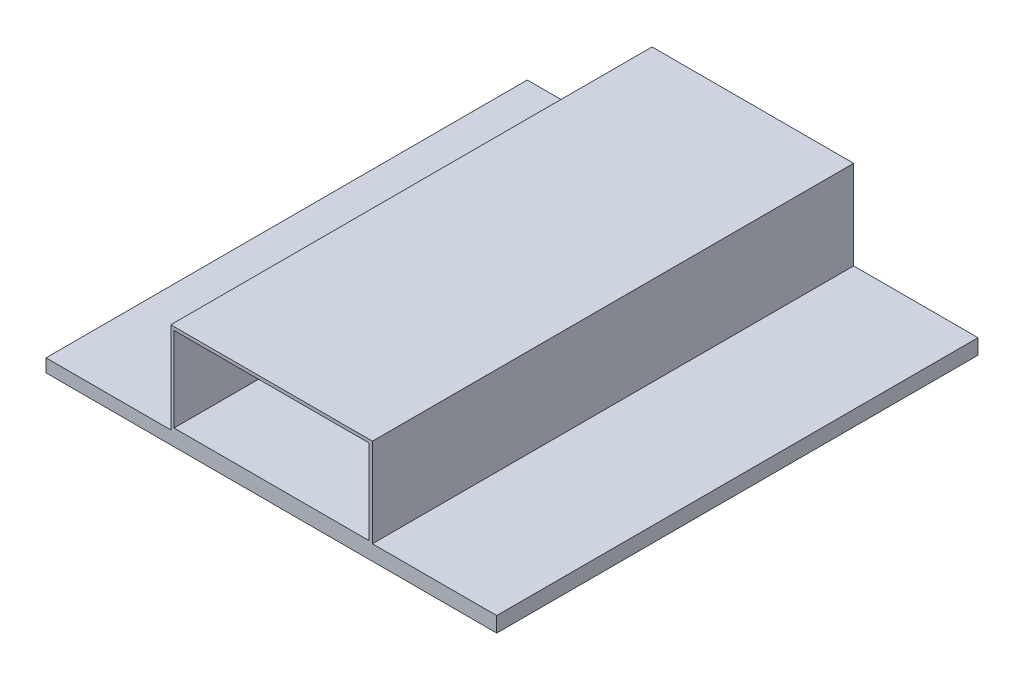
ISO-10303-21;
HEADER;
FILE_DESCRIPTION(('STEP AP214'),'2;1');
FILE_NAME('part.step','',(''),(''),'','','');
FILE_SCHEMA(('AUTOMOTIVE_DESIGN { 1 0 10303 214 1 1 1 1 }'));
ENDSEC;
DATA;
#1=APPLICATION_CONTEXT('core data for automotive mechanical design processes');
#2=APPLICATION_PROTOCOL_DEFINITION('international standard','automotive_design',2000,#1);
#3=PRODUCT_CONTEXT('',#1,'mechanical');
#4=PRODUCT('Part','Part','',(#3));
#5=PRODUCT_RELATED_PRODUCT_CATEGORY('part','',(#4));
#6=PRODUCT_DEFINITION_FORMATION('','',#4);
#7=PRODUCT_DEFINITION_CONTEXT('part definition',#1,'design');
#8=PRODUCT_DEFINITION('design','',#6,#7);
#9=PRODUCT_DEFINITION_SHAPE('','',#8);
#10=(LENGTH_UNIT() NAMED_UNIT(*) SI_UNIT(.MILLI.,.METRE.));
#11=(NAMED_UNIT(*) PLANE_ANGLE_UNIT() SI_UNIT($,.RADIAN.));
#12=(NAMED_UNIT(*) SI_UNIT($,.STERADIAN.) SOLID_ANGLE_UNIT());
#13=UNCERTAINTY_MEASURE_WITH_UNIT(LENGTH_MEASURE(1.E-05),#10,'distance_accuracy_value','');
#14=(GEOMETRIC_REPRESENTATION_CONTEXT(3) GLOBAL_UNCERTAINTY_ASSIGNED_CONTEXT((#13)) GLOBAL_UNIT_ASSIGNED_CONTEXT((#10,
#11,#12)) REPRESENTATION_CONTEXT('',''));
#15=CARTESIAN_POINT('',(0.,0.,0.));
#16=DIRECTION('',(0.,0.,1.));
#17=DIRECTION('',(1.,0.,0.));
#18=AXIS2_PLACEMENT_3D('',#15,#16,#17);
#19=CARTESIAN_POINT('',(-35.,-6.5,74.));
#20=DIRECTION('',(0.,-1.,0.));
#21=DIRECTION('',(1.,0.,0.));
#22=AXIS2_PLACEMENT_3D('',#19,#20,#21);
#23=PLANE('',#22);
#24=DIRECTION('',(-1.,0.,0.));
#25=VECTOR('',#24,1.);
#26=CARTESIAN_POINT('',(-35.,-6.5,0.));
#27=LINE('',#26,#25);
#28=CARTESIAN_POINT('',(-15.8118848487096,-6.5,0.));
#29=VERTEX_POINT('',#28);
#30=CARTESIAN_POINT('',(-35.,-6.5,0.));
#31=VERTEX_POINT('',#30);
#32=EDGE_CURVE('E150',#29,#31,#27,.T.);
#33=ORIENTED_EDGE('',*,*,#32,.T.);
#34=DIRECTION('',(0.,0.,-1.));
#35=VECTOR('',#34,1.);
#36=CARTESIAN_POINT('',(-35.,-6.5,74.));
#37=LINE('',#36,#35);
#38=CARTESIAN_POINT('',(-35.,-6.5,74.));
#39=VERTEX_POINT('',#38);
#40=EDGE_CURVE('E11',#39,#31,#37,.T.);
#41=ORIENTED_EDGE('',*,*,#40,.F.);
#42=DIRECTION('',(-1.,0.,0.));
#43=VECTOR('',#42,1.);
#44=CARTESIAN_POINT('',(-35.,-6.5,74.));
#45=LINE('',#44,#43);
#46=CARTESIAN_POINT('',(-15.8118848487096,-6.5,74.));
#47=VERTEX_POINT('',#46);
#48=EDGE_CURVE('E161',#47,#39,#45,.T.);
#49=ORIENTED_EDGE('',*,*,#48,.F.);
#50=DIRECTION('',(0.,0.,-1.));
#51=VECTOR('',#50,1.);
#52=CARTESIAN_POINT('',(-15.8118848487096,-6.5,74.));
#53=LINE('',#52,#51);
#54=EDGE_CURVE('E142',#47,#29,#53,.T.);
#55=ORIENTED_EDGE('',*,*,#54,.T.);
#56=EDGE_LOOP('',(#33,#41,#49,#55));
#57=FACE_BOUND('',#56,.T.);
#58=ADVANCED_FACE('F39',(#57),#23,.F.);
#59=CARTESIAN_POINT('',(-35.,-6.5,74.));
#60=DIRECTION('',(1.,0.,0.));
#61=DIRECTION('',(0.,1.,0.));
#62=AXIS2_PLACEMENT_3D('',#59,#60,#61);
#63=PLANE('',#62);
#64=DIRECTION('',(0.,-1.,0.));
#65=VECTOR('',#64,1.);
#66=CARTESIAN_POINT('',(-35.,-6.5,0.));
#67=LINE('',#66,#65);
#68=CARTESIAN_POINT('',(-35.,-8.5,0.));
#69=VERTEX_POINT('',#68);
#70=EDGE_CURVE('E148',#31,#69,#67,.T.);
#71=ORIENTED_EDGE('',*,*,#70,.T.);
#72=DIRECTION('',(0.,0.,-1.));
#73=VECTOR('',#72,1.);
#74=CARTESIAN_POINT('',(-35.,-8.5,74.));
#75=LINE('',#74,#73);
#76=CARTESIAN_POINT('',(-35.,-8.5,74.));
#77=VERTEX_POINT('',#76);
#78=EDGE_CURVE('E46',#77,#69,#75,.T.);
#79=ORIENTED_EDGE('',*,*,#78,.F.);
#80=DIRECTION('',(0.,-1.,0.));
#81=VECTOR('',#80,1.);
#82=CARTESIAN_POINT('',(-35.,-6.5,74.));
#83=LINE('',#82,#81);
#84=EDGE_CURVE('E104',#39,#77,#83,.T.);
#85=ORIENTED_EDGE('',*,*,#84,.F.);
#86=ORIENTED_EDGE('',*,*,#40,.T.);
#87=EDGE_LOOP('',(#71,#79,#85,#86));
#88=FACE_BOUND('',#87,.T.);
#89=ADVANCED_FACE('F266',(#88),#63,.F.);
#90=CARTESIAN_POINT('',(-35.,-8.5,74.));
#91=DIRECTION('',(0.,1.,0.));
#92=DIRECTION('',(0.,0.,1.));
#93=AXIS2_PLACEMENT_3D('',#90,#91,#92);
#94=PLANE('',#93);
#95=DIRECTION('',(1.,0.,0.));
#96=VECTOR('',#95,1.);
#97=CARTESIAN_POINT('',(-35.,-8.5,0.));
#98=LINE('',#97,#96);
#99=CARTESIAN_POINT('',(34.3038478878868,-8.5,0.));
#100=VERTEX_POINT('',#99);
#101=EDGE_CURVE('E151',#69,#100,#98,.T.);
#102=ORIENTED_EDGE('',*,*,#101,.T.);
#103=DIRECTION('',(0.,0.,-1.));
#104=VECTOR('',#103,1.);
#105=CARTESIAN_POINT('',(34.3038478878868,-8.5,74.));
#106=LINE('',#105,#104);
#107=CARTESIAN_POINT('',(34.3038478878868,-8.5,74.));
#108=VERTEX_POINT('',#107);
#109=EDGE_CURVE('E169',#108,#100,#106,.T.);
#110=ORIENTED_EDGE('',*,*,#109,.F.);
#111=DIRECTION('',(1.,0.,0.));
#112=VECTOR('',#111,1.);
#113=CARTESIAN_POINT('',(-35.,-8.5,74.));
#114=LINE('',#113,#112);
#115=EDGE_CURVE('E178',#77,#108,#114,.T.);
#116=ORIENTED_EDGE('',*,*,#115,.F.);
#117=ORIENTED_EDGE('',*,*,#78,.T.);
#118=EDGE_LOOP('',(#102,#110,#116,#117));
#119=FACE_BOUND('',#118,.T.);
#120=ADVANCED_FACE('F176',(#119),#94,.F.);
#121=CARTESIAN_POINT('',(34.3038478878868,-8.5,74.));
#122=DIRECTION('',(-1.,0.,0.));
#123=DIRECTION('',(0.,0.,1.));
#124=AXIS2_PLACEMENT_3D('',#121,#122,#123);
#125=PLANE('',#124);
#126=DIRECTION('',(0.,1.,0.));
#127=VECTOR('',#126,1.);
#128=CARTESIAN_POINT('',(34.3038478878868,-8.5,0.));
#129=LINE('',#128,#127);
#130=CARTESIAN_POINT('',(34.3038478878868,-6.16277903220504,0.));
#131=VERTEX_POINT('',#130);
#132=EDGE_CURVE('E154',#100,#131,#129,.T.);
#133=ORIENTED_EDGE('',*,*,#132,.T.);
#134=DIRECTION('',(0.,0.,-1.));
#135=VECTOR('',#134,1.);
#136=CARTESIAN_POINT('',(34.3038478878868,-6.16277903220504,74.));
#137=LINE('',#136,#135);
#138=CARTESIAN_POINT('',(34.3038478878868,-6.16277903220504,74.));
#139=VERTEX_POINT('',#138);
#140=EDGE_CURVE('E167',#139,#131,#137,.T.);
#141=ORIENTED_EDGE('',*,*,#140,.F.);
#142=DIRECTION('',(0.,1.,0.));
#143=VECTOR('',#142,1.);
#144=CARTESIAN_POINT('',(34.3038478878868,-8.5,74.));
#145=LINE('',#144,#143);
#146=EDGE_CURVE('E189',#108,#139,#145,.T.);
#147=ORIENTED_EDGE('',*,*,#146,.F.);
#148=ORIENTED_EDGE('',*,*,#109,.T.);
#149=EDGE_LOOP('',(#133,#141,#147,#148));
#150=FACE_BOUND('',#149,.T.);
#151=ADVANCED_FACE('F186',(#150),#125,.F.);
#152=CARTESIAN_POINT('',(15.1881151512904,-6.16277903220504,74.));
#153=DIRECTION('',(0.,-1.,0.));
#154=DIRECTION('',(1.,0.,0.));
#155=AXIS2_PLACEMENT_3D('',#152,#153,#154);
#156=PLANE('',#155);
#157=DIRECTION('',(-1.,0.,0.));
#158=VECTOR('',#157,1.);
#159=CARTESIAN_POINT('',(15.1881151512904,-6.16277903220504,0.));
#160=LINE('',#159,#158);
#161=CARTESIAN_POINT('',(15.1881151512904,-6.16277903220504,0.));
#162=VERTEX_POINT('',#161);
#163=EDGE_CURVE('E160',#131,#162,#160,.T.);
#164=ORIENTED_EDGE('',*,*,#163,.T.);
#165=DIRECTION('',(0.,0.,-1.));
#166=VECTOR('',#165,1.);
#167=CARTESIAN_POINT('',(15.1881151512904,-6.16277903220504,74.));
#168=LINE('',#167,#166);
#169=CARTESIAN_POINT('',(15.1881151512904,-6.16277903220504,74.));
#170=VERTEX_POINT('',#169);
#171=EDGE_CURVE('E138',#170,#162,#168,.T.);
#172=ORIENTED_EDGE('',*,*,#171,.F.);
#173=DIRECTION('',(-1.,0.,0.));
#174=VECTOR('',#173,1.);
#175=CARTESIAN_POINT('',(15.1881151512904,-6.16277903220504,74.));
#176=LINE('',#175,#174);
#177=EDGE_CURVE('E128',#139,#170,#176,.T.);
#178=ORIENTED_EDGE('',*,*,#177,.F.);
#179=ORIENTED_EDGE('',*,*,#140,.T.);
#180=EDGE_LOOP('',(#164,#172,#178,#179));
#181=FACE_BOUND('',#180,.T.);
#182=ADVANCED_FACE('F188',(#181),#156,.F.);
#183=CARTESIAN_POINT('',(15.1881151512904,7.5,74.));
#184=DIRECTION('',(-1.,0.,0.));
#185=DIRECTION('',(0.,-1.,0.));
#186=AXIS2_PLACEMENT_3D('',#183,#184,#185);
#187=PLANE('',#186);
#188=DIRECTION('',(0.,1.,0.));
#189=VECTOR('',#188,1.);
#190=CARTESIAN_POINT('',(15.1881151512904,7.5,0.));
#191=LINE('',#190,#189);
#192=CARTESIAN_POINT('',(15.1881151512904,7.5,0.));
#193=VERTEX_POINT('',#192);
#194=EDGE_CURVE('E134',#162,#193,#191,.T.);
#195=ORIENTED_EDGE('',*,*,#194,.T.);
#196=DIRECTION('',(0.,0.,-1.));
#197=VECTOR('',#196,1.);
#198=CARTESIAN_POINT('',(15.1881151512904,7.5,74.));
#199=LINE('',#198,#197);
#200=CARTESIAN_POINT('',(15.1881151512904,7.5,74.));
#201=VERTEX_POINT('',#200);
#202=EDGE_CURVE('E135',#201,#193,#199,.T.);
#203=ORIENTED_EDGE('',*,*,#202,.F.);
#204=DIRECTION('',(0.,1.,0.));
#205=VECTOR('',#204,1.);
#206=CARTESIAN_POINT('',(15.1881151512904,7.5,74.));
#207=LINE('',#206,#205);
#208=EDGE_CURVE('E117',#170,#201,#207,.T.);
#209=ORIENTED_EDGE('',*,*,#208,.F.);
#210=ORIENTED_EDGE('',*,*,#171,.T.);
#211=EDGE_LOOP('',(#195,#203,#209,#210));
#212=FACE_BOUND('',#211,.T.);
#213=ADVANCED_FACE('F133',(#212),#187,.F.);
#214=CARTESIAN_POINT('',(-15.8118848487096,7.5,74.));
#215=DIRECTION('',(0.,-1.,0.));
#216=DIRECTION('',(0.,0.,-1.));
#217=AXIS2_PLACEMENT_3D('',#214,#215,#216);
#218=PLANE('',#217);
#219=DIRECTION('',(-1.,0.,0.));
#220=VECTOR('',#219,1.);
#221=CARTESIAN_POINT('',(-15.8118848487096,7.5,0.));
#222=LINE('',#221,#220);
#223=CARTESIAN_POINT('',(-15.8118848487096,7.5,0.));
#224=VERTEX_POINT('',#223);
#225=EDGE_CURVE('E158',#193,#224,#222,.T.);
#226=ORIENTED_EDGE('',*,*,#225,.T.);
#227=DIRECTION('',(0.,0.,-1.));
#228=VECTOR('',#227,1.);
#229=CARTESIAN_POINT('',(-15.8118848487096,7.5,74.));
#230=LINE('',#229,#228);
#231=CARTESIAN_POINT('',(-15.8118848487096,7.5,74.));
#232=VERTEX_POINT('',#231);
#233=EDGE_CURVE('E137',#232,#224,#230,.T.);
#234=ORIENTED_EDGE('',*,*,#233,.F.);
#235=DIRECTION('',(-1.,0.,0.));
#236=VECTOR('',#235,1.);
#237=CARTESIAN_POINT('',(-15.8118848487096,7.5,74.));
#238=LINE('',#237,#236);
#239=EDGE_CURVE('E121',#201,#232,#238,.T.);
#240=ORIENTED_EDGE('',*,*,#239,.F.);
#241=ORIENTED_EDGE('',*,*,#202,.T.);
#242=EDGE_LOOP('',(#226,#234,#240,#241));
#243=FACE_BOUND('',#242,.T.);
#244=ADVANCED_FACE('F141',(#243),#218,.F.);
#245=CARTESIAN_POINT('',(-15.8118848487096,-6.5,74.));
#246=DIRECTION('',(1.,0.,0.));
#247=DIRECTION('',(0.,0.,-1.));
#248=AXIS2_PLACEMENT_3D('',#245,#246,#247);
#249=PLANE('',#248);
#250=DIRECTION('',(0.,-1.,0.));
#251=VECTOR('',#250,1.);
#252=CARTESIAN_POINT('',(-15.8118848487096,-6.5,0.));
#253=LINE('',#252,#251);
#254=EDGE_CURVE('E94',#224,#29,#253,.T.);
#255=ORIENTED_EDGE('',*,*,#254,.T.);
#256=ORIENTED_EDGE('',*,*,#54,.F.);
#257=DIRECTION('',(0.,-1.,0.));
#258=VECTOR('',#257,1.);
#259=CARTESIAN_POINT('',(-15.8118848487096,-6.5,74.));
#260=LINE('',#259,#258);
#261=EDGE_CURVE('E65',#232,#47,#260,.T.);
#262=ORIENTED_EDGE('',*,*,#261,.F.);
#263=ORIENTED_EDGE('',*,*,#233,.T.);
#264=EDGE_LOOP('',(#255,#256,#262,#263));
#265=FACE_BOUND('',#264,.T.);
#266=ADVANCED_FACE('F273',(#265),#249,.F.);
#267=CARTESIAN_POINT('',(0.,0.,74.));
#268=DIRECTION('',(0.,0.,1.));
#269=DIRECTION('',(1.,0.,0.));
#270=AXIS2_PLACEMENT_3D('',#267,#268,#269);
#271=PLANE('',#270);
#272=DIRECTION('',(0.,1.,0.));
#273=VECTOR('',#272,1.);
#274=CARTESIAN_POINT('',(14.6881151512904,-6.00000000000001,74.));
#275=LINE('',#274,#273);
#276=CARTESIAN_POINT('',(14.6881151512904,-6.00000000000001,74.));
#277=VERTEX_POINT('',#276);
#278=CARTESIAN_POINT('',(14.6881151512904,6.99999999999999,74.));
#279=VERTEX_POINT('',#278);
#280=EDGE_CURVE('E52',#277,#279,#275,.T.);
#281=ORIENTED_EDGE('',*,*,#280,.F.);
#282=DIRECTION('',(1.,0.,0.));
#283=VECTOR('',#282,1.);
#284=CARTESIAN_POINT('',(-15.3118848487096,-6.00000000000001,74.));
#285=LINE('',#284,#283);
#286=CARTESIAN_POINT('',(-15.3118848487096,-6.00000000000001,74.));
#287=VERTEX_POINT('',#286);
#288=EDGE_CURVE('E208',#287,#277,#285,.T.);
#289=ORIENTED_EDGE('',*,*,#288,.F.);
#290=DIRECTION('',(0.,-1.,0.));
#291=VECTOR('',#290,1.);
#292=CARTESIAN_POINT('',(-15.3118848487096,-6.00000000000001,74.));
#293=LINE('',#292,#291);
#294=CARTESIAN_POINT('',(-15.3118848487096,6.99999999999999,74.));
#295=VERTEX_POINT('',#294);
#296=EDGE_CURVE('E209',#295,#287,#293,.T.);
#297=ORIENTED_EDGE('',*,*,#296,.F.);
#298=DIRECTION('',(-1.,0.,0.));
#299=VECTOR('',#298,1.);
#300=CARTESIAN_POINT('',(-15.3118848487096,6.99999999999999,74.));
#301=LINE('',#300,#299);
#302=EDGE_CURVE('E211',#279,#295,#301,.T.);
#303=ORIENTED_EDGE('',*,*,#302,.F.);
#304=EDGE_LOOP('',(#281,#289,#297,#303));
#305=FACE_BOUND('',#304,.T.);
#306=ORIENTED_EDGE('',*,*,#48,.T.);
#307=ORIENTED_EDGE('',*,*,#84,.T.);
#308=ORIENTED_EDGE('',*,*,#115,.T.);
#309=ORIENTED_EDGE('',*,*,#146,.T.);
#310=ORIENTED_EDGE('',*,*,#177,.T.);
#311=ORIENTED_EDGE('',*,*,#208,.T.);
#312=ORIENTED_EDGE('',*,*,#239,.T.);
#313=ORIENTED_EDGE('',*,*,#261,.T.);
#314=EDGE_LOOP('',(#306,#307,#308,#309,#310,#311,#312,#313));
#315=FACE_BOUND('',#314,.T.);
#316=ADVANCED_FACE('F123',(#305,#315),#271,.T.);
#317=CARTESIAN_POINT('',(0.,0.,0.));
#318=DIRECTION('',(0.,0.,1.));
#319=DIRECTION('',(1.,0.,0.));
#320=AXIS2_PLACEMENT_3D('',#317,#318,#319);
#321=PLANE('',#320);
#322=ORIENTED_EDGE('',*,*,#32,.F.);
#323=ORIENTED_EDGE('',*,*,#254,.F.);
#324=ORIENTED_EDGE('',*,*,#225,.F.);
#325=ORIENTED_EDGE('',*,*,#194,.F.);
#326=ORIENTED_EDGE('',*,*,#163,.F.);
#327=ORIENTED_EDGE('',*,*,#132,.F.);
#328=ORIENTED_EDGE('',*,*,#101,.F.);
#329=ORIENTED_EDGE('',*,*,#70,.F.);
#330=EDGE_LOOP('',(#322,#323,#324,#325,#326,#327,#328,#329));
#331=FACE_BOUND('',#330,.T.);
#332=ADVANCED_FACE('F185',(#331),#321,.F.);
#333=CARTESIAN_POINT('',(14.6881151512904,-6.00000000000001,2.));
#334=DIRECTION('',(1.,0.,0.));
#335=DIRECTION('',(0.,0.,-1.));
#336=AXIS2_PLACEMENT_3D('',#333,#334,#335);
#337=PLANE('',#336);
#338=ORIENTED_EDGE('',*,*,#280,.T.);
#339=DIRECTION('',(0.,0.,1.));
#340=VECTOR('',#339,1.);
#341=CARTESIAN_POINT('',(14.6881151512904,6.99999999999999,2.));
#342=LINE('',#341,#340);
#343=CARTESIAN_POINT('',(14.6881151512904,6.99999999999999,2.));
#344=VERTEX_POINT('',#343);
#345=EDGE_CURVE('E198',#344,#279,#342,.T.);
#346=ORIENTED_EDGE('',*,*,#345,.F.);
#347=DIRECTION('',(0.,1.,0.));
#348=VECTOR('',#347,1.);
#349=CARTESIAN_POINT('',(14.6881151512904,-6.00000000000001,2.));
#350=LINE('',#349,#348);
#351=CARTESIAN_POINT('',(14.6881151512904,-6.00000000000001,2.));
#352=VERTEX_POINT('',#351);
#353=EDGE_CURVE('E207',#352,#344,#350,.T.);
#354=ORIENTED_EDGE('',*,*,#353,.F.);
#355=DIRECTION('',(0.,0.,1.));
#356=VECTOR('',#355,1.);
#357=CARTESIAN_POINT('',(14.6881151512904,-6.00000000000001,2.));
#358=LINE('',#357,#356);
#359=EDGE_CURVE('E153',#352,#277,#358,.T.);
#360=ORIENTED_EDGE('',*,*,#359,.T.);
#361=EDGE_LOOP('',(#338,#346,#354,#360));
#362=FACE_BOUND('',#361,.T.);
#363=ADVANCED_FACE('F233',(#362),#337,.F.);
#364=CARTESIAN_POINT('',(-15.3118848487096,-6.00000000000001,2.));
#365=DIRECTION('',(0.,-1.,0.));
#366=DIRECTION('',(0.,0.,-1.));
#367=AXIS2_PLACEMENT_3D('',#364,#365,#366);
#368=PLANE('',#367);
#369=ORIENTED_EDGE('',*,*,#288,.T.);
#370=ORIENTED_EDGE('',*,*,#359,.F.);
#371=DIRECTION('',(1.,0.,0.));
#372=VECTOR('',#371,1.);
#373=CARTESIAN_POINT('',(-15.3118848487096,-6.00000000000001,2.));
#374=LINE('',#373,#372);
#375=CARTESIAN_POINT('',(-15.3118848487096,-6.00000000000001,2.));
#376=VERTEX_POINT('',#375);
#377=EDGE_CURVE('E197',#376,#352,#374,.T.);
#378=ORIENTED_EDGE('',*,*,#377,.F.);
#379=DIRECTION('',(0.,0.,1.));
#380=VECTOR('',#379,1.);
#381=CARTESIAN_POINT('',(-15.3118848487096,-6.00000000000001,2.));
#382=LINE('',#381,#380);
#383=EDGE_CURVE('E205',#376,#287,#382,.T.);
#384=ORIENTED_EDGE('',*,*,#383,.T.);
#385=EDGE_LOOP('',(#369,#370,#378,#384));
#386=FACE_BOUND('',#385,.T.);
#387=ADVANCED_FACE('F244',(#386),#368,.F.);
#388=CARTESIAN_POINT('',(-15.3118848487096,-6.00000000000001,2.));
#389=DIRECTION('',(-1.,0.,0.));
#390=DIRECTION('',(0.,0.,1.));
#391=AXIS2_PLACEMENT_3D('',#388,#389,#390);
#392=PLANE('',#391);
#393=ORIENTED_EDGE('',*,*,#296,.T.);
#394=ORIENTED_EDGE('',*,*,#383,.F.);
#395=DIRECTION('',(0.,-1.,0.));
#396=VECTOR('',#395,1.);
#397=CARTESIAN_POINT('',(-15.3118848487096,-6.00000000000001,2.));
#398=LINE('',#397,#396);
#399=CARTESIAN_POINT('',(-15.3118848487096,6.99999999999999,2.));
#400=VERTEX_POINT('',#399);
#401=EDGE_CURVE('E219',#400,#376,#398,.T.);
#402=ORIENTED_EDGE('',*,*,#401,.F.);
#403=DIRECTION('',(0.,0.,1.));
#404=VECTOR('',#403,1.);
#405=CARTESIAN_POINT('',(-15.3118848487096,6.99999999999999,2.));
#406=LINE('',#405,#404);
#407=EDGE_CURVE('E196',#400,#295,#406,.T.);
#408=ORIENTED_EDGE('',*,*,#407,.T.);
#409=EDGE_LOOP('',(#393,#394,#402,#408));
#410=FACE_BOUND('',#409,.T.);
#411=ADVANCED_FACE('F248',(#410),#392,.F.);
#412=CARTESIAN_POINT('',(-15.3118848487096,6.99999999999999,2.));
#413=DIRECTION('',(0.,1.,0.));
#414=DIRECTION('',(0.,0.,1.));
#415=AXIS2_PLACEMENT_3D('',#412,#413,#414);
#416=PLANE('',#415);
#417=ORIENTED_EDGE('',*,*,#302,.T.);
#418=ORIENTED_EDGE('',*,*,#407,.F.);
#419=DIRECTION('',(-1.,0.,0.));
#420=VECTOR('',#419,1.);
#421=CARTESIAN_POINT('',(-15.3118848487096,6.99999999999999,2.));
#422=LINE('',#421,#420);
#423=EDGE_CURVE('E225',#344,#400,#422,.T.);
#424=ORIENTED_EDGE('',*,*,#423,.F.);
#425=ORIENTED_EDGE('',*,*,#345,.T.);
#426=EDGE_LOOP('',(#417,#418,#424,#425));
#427=FACE_BOUND('',#426,.T.);
#428=ADVANCED_FACE('F254',(#427),#416,.F.);
#429=CARTESIAN_POINT('',(0.,0.,2.));
#430=DIRECTION('',(0.,0.,-1.));
#431=DIRECTION('',(-1.,0.,0.));
#432=AXIS2_PLACEMENT_3D('',#429,#430,#431);
#433=PLANE('',#432);
#434=ORIENTED_EDGE('',*,*,#353,.T.);
#435=ORIENTED_EDGE('',*,*,#423,.T.);
#436=ORIENTED_EDGE('',*,*,#401,.T.);
#437=ORIENTED_EDGE('',*,*,#377,.T.);
#438=EDGE_LOOP('',(#434,#435,#436,#437));
#439=FACE_BOUND('',#438,.T.);
#440=ADVANCED_FACE('F227',(#439),#433,.F.);
#441=CLOSED_SHELL('',(#58,#89,#120,#151,#182,#213,#244,#266,#316,#332,#363,#387,#411,#428,#440));
#442=MANIFOLD_SOLID_BREP('B2',#441);
#443=ADVANCED_BREP_SHAPE_REPRESENTATION('',(#18,#442),#14);
#444=SHAPE_DEFINITION_REPRESENTATION(#9,#443);
ENDSEC;
END-ISO-10303-21;
